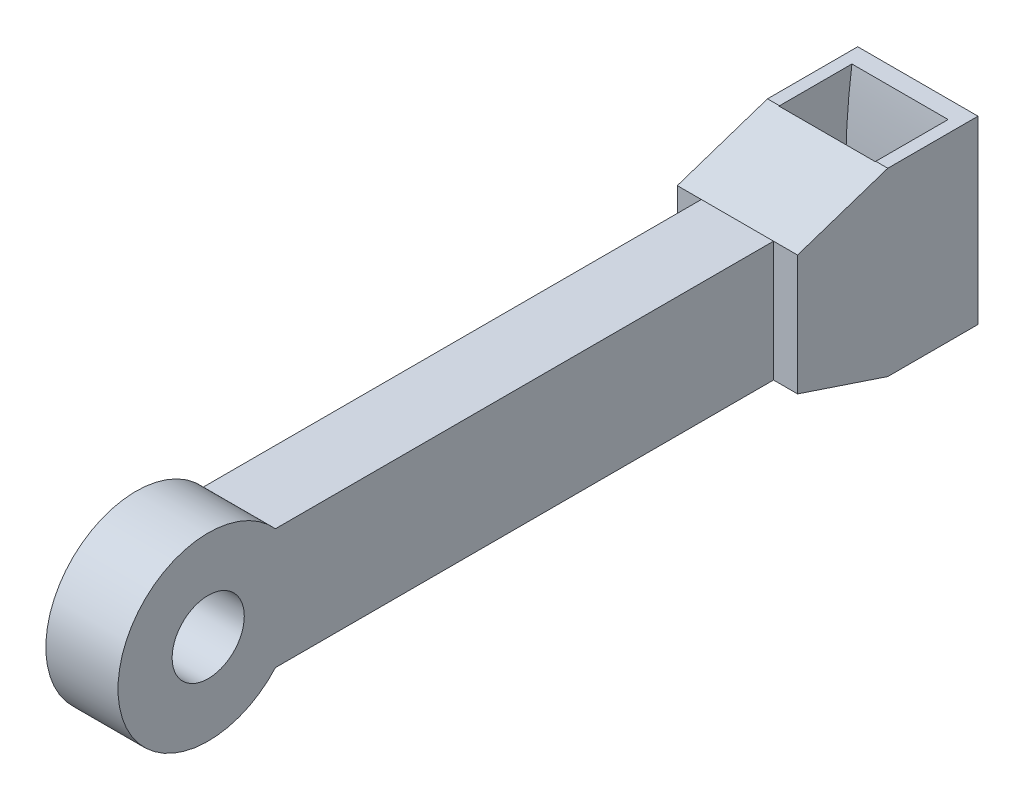
ISO-10303-21;
HEADER;
FILE_DESCRIPTION(('STEP AP214'),'2;1');
FILE_NAME('part.step','',(''),(''),'','','');
FILE_SCHEMA(('AUTOMOTIVE_DESIGN { 1 0 10303 214 1 1 1 1 }'));
ENDSEC;
DATA;
#1=APPLICATION_CONTEXT('core data for automotive mechanical design processes');
#2=APPLICATION_PROTOCOL_DEFINITION('international standard','automotive_design',2000,#1);
#3=PRODUCT_CONTEXT('',#1,'mechanical');
#4=PRODUCT('Part','Part','',(#3));
#5=PRODUCT_RELATED_PRODUCT_CATEGORY('part','',(#4));
#6=PRODUCT_DEFINITION_FORMATION('','',#4);
#7=PRODUCT_DEFINITION_CONTEXT('part definition',#1,'design');
#8=PRODUCT_DEFINITION('design','',#6,#7);
#9=PRODUCT_DEFINITION_SHAPE('','',#8);
#10=(LENGTH_UNIT() NAMED_UNIT(*) SI_UNIT(.MILLI.,.METRE.));
#11=(NAMED_UNIT(*) PLANE_ANGLE_UNIT() SI_UNIT($,.RADIAN.));
#12=(NAMED_UNIT(*) SI_UNIT($,.STERADIAN.) SOLID_ANGLE_UNIT());
#13=UNCERTAINTY_MEASURE_WITH_UNIT(LENGTH_MEASURE(1.E-05),#10,'distance_accuracy_value','');
#14=(GEOMETRIC_REPRESENTATION_CONTEXT(3) GLOBAL_UNCERTAINTY_ASSIGNED_CONTEXT((#13)) GLOBAL_UNIT_ASSIGNED_CONTEXT((#10,
#11,#12)) REPRESENTATION_CONTEXT('',''));
#15=CARTESIAN_POINT('',(0.,0.,0.));
#16=DIRECTION('',(0.,0.,1.));
#17=DIRECTION('',(1.,0.,0.));
#18=AXIS2_PLACEMENT_3D('',#15,#16,#17);
#19=CARTESIAN_POINT('',(0.,-2.5,67.));
#20=DIRECTION('',(0.,-1.,0.));
#21=DIRECTION('',(0.,0.,-1.));
#22=AXIS2_PLACEMENT_3D('',#19,#20,#21);
#23=PLANE('',#22);
#24=DIRECTION('',(0.,0.,-1.));
#25=VECTOR('',#24,1.);
#26=CARTESIAN_POINT('',(2.00000000000001,-2.5,67.));
#27=LINE('',#26,#25);
#28=CARTESIAN_POINT('',(2.00000000000001,-2.5,56.4098300562505));
#29=VERTEX_POINT('',#28);
#30=CARTESIAN_POINT('',(2.,-2.5,15.));
#31=VERTEX_POINT('',#30);
#32=EDGE_CURVE('E169',#29,#31,#27,.T.);
#33=ORIENTED_EDGE('',*,*,#32,.F.);
#34=DIRECTION('',(-1.,0.,0.));
#35=VECTOR('',#34,1.);
#36=CARTESIAN_POINT('',(10.,-2.5,56.4098300562505));
#37=LINE('',#36,#35);
#38=CARTESIAN_POINT('',(8.00000000000001,-2.5,56.4098300562505));
#39=VERTEX_POINT('',#38);
#40=EDGE_CURVE('E11',#29,#39,#37,.F.);
#41=ORIENTED_EDGE('',*,*,#40,.T.);
#42=DIRECTION('',(0.,0.,1.));
#43=VECTOR('',#42,1.);
#44=CARTESIAN_POINT('',(8.00000000000001,-2.5,67.));
#45=LINE('',#44,#43);
#46=CARTESIAN_POINT('',(8.,-2.5,15.));
#47=VERTEX_POINT('',#46);
#48=EDGE_CURVE('E57',#47,#39,#45,.T.);
#49=ORIENTED_EDGE('',*,*,#48,.F.);
#50=DIRECTION('',(1.,0.,0.));
#51=VECTOR('',#50,1.);
#52=CARTESIAN_POINT('',(0.,-2.5,15.));
#53=LINE('',#52,#51);
#54=EDGE_CURVE('E179',#31,#47,#53,.T.);
#55=ORIENTED_EDGE('',*,*,#54,.F.);
#56=EDGE_LOOP('',(#33,#41,#49,#55));
#57=FACE_BOUND('',#56,.T.);
#58=ADVANCED_FACE('F39',(#57),#23,.F.);
#59=CARTESIAN_POINT('',(0.,0.,15.));
#60=DIRECTION('',(1.,0.,0.));
#61=DIRECTION('',(0.,1.,0.));
#62=AXIS2_PLACEMENT_3D('',#59,#60,#61);
#63=PLANE('',#62);
#64=DIRECTION('',(0.,-1.,0.));
#65=VECTOR('',#64,1.);
#66=CARTESIAN_POINT('',(0.,7.5,15.));
#67=LINE('',#66,#65);
#68=CARTESIAN_POINT('',(0.,-2.5,15.));
#69=VERTEX_POINT('',#68);
#70=CARTESIAN_POINT('',(0.,-12.5,15.));
#71=VERTEX_POINT('',#70);
#72=EDGE_CURVE('E220',#69,#71,#67,.T.);
#73=ORIENTED_EDGE('',*,*,#72,.F.);
#74=DIRECTION('',(0.,0.316227766016838,-0.948683298050514));
#75=VECTOR('',#74,1.);
#76=CARTESIAN_POINT('',(0.,-2.25,14.25));
#77=LINE('',#76,#75);
#78=CARTESIAN_POINT('',(0.,0.,7.5));
#79=VERTEX_POINT('',#78);
#80=EDGE_CURVE('E304',#69,#79,#77,.T.);
#81=ORIENTED_EDGE('',*,*,#80,.T.);
#82=DIRECTION('',(0.,0.,-1.));
#83=VECTOR('',#82,1.);
#84=CARTESIAN_POINT('',(0.,0.,15.));
#85=LINE('',#84,#83);
#86=CARTESIAN_POINT('',(0.,0.,0.));
#87=VERTEX_POINT('',#86);
#88=EDGE_CURVE('E324',#79,#87,#85,.T.);
#89=ORIENTED_EDGE('',*,*,#88,.T.);
#90=DIRECTION('',(0.,-1.,0.));
#91=VECTOR('',#90,1.);
#92=CARTESIAN_POINT('',(0.,0.,0.));
#93=LINE('',#92,#91);
#94=CARTESIAN_POINT('',(0.,-15.,0.));
#95=VERTEX_POINT('',#94);
#96=EDGE_CURVE('E308',#87,#95,#93,.T.);
#97=ORIENTED_EDGE('',*,*,#96,.T.);
#98=DIRECTION('',(0.,0.,-1.));
#99=VECTOR('',#98,1.);
#100=CARTESIAN_POINT('',(0.,-15.,15.));
#101=LINE('',#100,#99);
#102=CARTESIAN_POINT('',(0.,-15.,7.5));
#103=VERTEX_POINT('',#102);
#104=EDGE_CURVE('E332',#103,#95,#101,.T.);
#105=ORIENTED_EDGE('',*,*,#104,.F.);
#106=DIRECTION('',(0.,0.316227766016838,0.948683298050514));
#107=VECTOR('',#106,1.);
#108=CARTESIAN_POINT('',(0.,-11.25,18.75));
#109=LINE('',#108,#107);
#110=EDGE_CURVE('E293',#103,#71,#109,.T.);
#111=ORIENTED_EDGE('',*,*,#110,.T.);
#112=EDGE_LOOP('',(#73,#81,#89,#97,#105,#111));
#113=FACE_BOUND('',#112,.T.);
#114=ADVANCED_FACE('F41',(#113),#63,.F.);
#115=CARTESIAN_POINT('',(10.,0.,15.));
#116=DIRECTION('',(-1.,0.,0.));
#117=DIRECTION('',(0.,-1.,0.));
#118=AXIS2_PLACEMENT_3D('',#115,#116,#117);
#119=PLANE('',#118);
#120=DIRECTION('',(0.,-1.,0.));
#121=VECTOR('',#120,1.);
#122=CARTESIAN_POINT('',(10.,7.5,15.));
#123=LINE('',#122,#121);
#124=CARTESIAN_POINT('',(10.,-2.5,15.));
#125=VERTEX_POINT('',#124);
#126=CARTESIAN_POINT('',(10.,-12.5,15.));
#127=VERTEX_POINT('',#126);
#128=EDGE_CURVE('E162',#125,#127,#123,.T.);
#129=ORIENTED_EDGE('',*,*,#128,.T.);
#130=DIRECTION('',(0.,0.316227766016838,0.948683298050514));
#131=VECTOR('',#130,1.);
#132=CARTESIAN_POINT('',(10.,-15.,7.5));
#133=LINE('',#132,#131);
#134=CARTESIAN_POINT('',(10.,-15.,7.5));
#135=VERTEX_POINT('',#134);
#136=EDGE_CURVE('E283',#135,#127,#133,.T.);
#137=ORIENTED_EDGE('',*,*,#136,.F.);
#138=DIRECTION('',(0.,0.,-1.));
#139=VECTOR('',#138,1.);
#140=CARTESIAN_POINT('',(10.,-15.,15.));
#141=LINE('',#140,#139);
#142=CARTESIAN_POINT('',(10.,-15.,0.));
#143=VERTEX_POINT('',#142);
#144=EDGE_CURVE('E330',#135,#143,#141,.T.);
#145=ORIENTED_EDGE('',*,*,#144,.T.);
#146=DIRECTION('',(0.,1.,0.));
#147=VECTOR('',#146,1.);
#148=CARTESIAN_POINT('',(10.,0.,0.));
#149=LINE('',#148,#147);
#150=CARTESIAN_POINT('',(10.,0.,0.));
#151=VERTEX_POINT('',#150);
#152=EDGE_CURVE('E316',#143,#151,#149,.T.);
#153=ORIENTED_EDGE('',*,*,#152,.T.);
#154=DIRECTION('',(0.,0.,-1.));
#155=VECTOR('',#154,1.);
#156=CARTESIAN_POINT('',(10.,0.,15.));
#157=LINE('',#156,#155);
#158=CARTESIAN_POINT('',(10.,0.,7.5));
#159=VERTEX_POINT('',#158);
#160=EDGE_CURVE('E327',#159,#151,#157,.T.);
#161=ORIENTED_EDGE('',*,*,#160,.F.);
#162=DIRECTION('',(0.,0.316227766016838,-0.948683298050514));
#163=VECTOR('',#162,1.);
#164=CARTESIAN_POINT('',(10.,0.,7.5));
#165=LINE('',#164,#163);
#166=EDGE_CURVE('E284',#125,#159,#165,.T.);
#167=ORIENTED_EDGE('',*,*,#166,.F.);
#168=EDGE_LOOP('',(#129,#137,#145,#153,#161,#167));
#169=FACE_BOUND('',#168,.T.);
#170=ADVANCED_FACE('F372',(#169),#119,.F.);
#171=CARTESIAN_POINT('',(0.,-12.5,67.));
#172=DIRECTION('',(0.,1.,0.));
#173=DIRECTION('',(0.,0.,1.));
#174=AXIS2_PLACEMENT_3D('',#171,#172,#173);
#175=PLANE('',#174);
#176=DIRECTION('',(0.,0.,1.));
#177=VECTOR('',#176,1.);
#178=CARTESIAN_POINT('',(2.00000000000001,-12.5,67.));
#179=LINE('',#178,#177);
#180=CARTESIAN_POINT('',(2.,-12.5,15.));
#181=VERTEX_POINT('',#180);
#182=CARTESIAN_POINT('',(2.00000000000001,-12.5,56.4098300562505));
#183=VERTEX_POINT('',#182);
#184=EDGE_CURVE('E65',#181,#183,#179,.T.);
#185=ORIENTED_EDGE('',*,*,#184,.F.);
#186=DIRECTION('',(-1.,0.,0.));
#187=VECTOR('',#186,1.);
#188=CARTESIAN_POINT('',(0.,-12.5,15.));
#189=LINE('',#188,#187);
#190=CARTESIAN_POINT('',(8.,-12.5,15.));
#191=VERTEX_POINT('',#190);
#192=EDGE_CURVE('E195',#191,#181,#189,.T.);
#193=ORIENTED_EDGE('',*,*,#192,.F.);
#194=DIRECTION('',(0.,0.,-1.));
#195=VECTOR('',#194,1.);
#196=CARTESIAN_POINT('',(8.00000000000001,-12.5,67.));
#197=LINE('',#196,#195);
#198=CARTESIAN_POINT('',(8.00000000000001,-12.5,56.4098300562505));
#199=VERTEX_POINT('',#198);
#200=EDGE_CURVE('E173',#199,#191,#197,.T.);
#201=ORIENTED_EDGE('',*,*,#200,.F.);
#202=DIRECTION('',(-1.,0.,0.));
#203=VECTOR('',#202,1.);
#204=CARTESIAN_POINT('',(10.,-12.5,56.4098300562505));
#205=LINE('',#204,#203);
#206=EDGE_CURVE('E168',#199,#183,#205,.T.);
#207=ORIENTED_EDGE('',*,*,#206,.T.);
#208=EDGE_LOOP('',(#185,#193,#201,#207));
#209=FACE_BOUND('',#208,.T.);
#210=ADVANCED_FACE('F346',(#209),#175,.F.);
#211=CARTESIAN_POINT('',(10.,-7.49999999999999,62.));
#212=DIRECTION('',(-1.,0.,0.));
#213=DIRECTION('',(0.,-1.,0.));
#214=AXIS2_PLACEMENT_3D('',#211,#212,#213);
#215=CYLINDRICAL_SURFACE('',#214,7.50000000000001);
#216=ORIENTED_EDGE('',*,*,#40,.F.);
#217=CARTESIAN_POINT('',(2.00000000000001,-7.5,62.));
#218=DIRECTION('',(-1.,0.,0.));
#219=DIRECTION('',(0.,0.,1.));
#220=AXIS2_PLACEMENT_3D('',#217,#218,#219);
#221=CIRCLE('',#220,7.50000000000001);
#222=EDGE_CURVE('E230',#29,#183,#221,.F.);
#223=ORIENTED_EDGE('',*,*,#222,.T.);
#224=ORIENTED_EDGE('',*,*,#206,.F.);
#225=CARTESIAN_POINT('',(8.00000000000001,-7.49999999999999,62.));
#226=DIRECTION('',(1.,0.,0.));
#227=DIRECTION('',(0.,0.,-1.));
#228=AXIS2_PLACEMENT_3D('',#225,#226,#227);
#229=CIRCLE('',#228,7.50000000000001);
#230=EDGE_CURVE('E213',#199,#39,#229,.F.);
#231=ORIENTED_EDGE('',*,*,#230,.T.);
#232=EDGE_LOOP('',(#216,#223,#224,#231));
#233=FACE_BOUND('',#232,.T.);
#234=ADVANCED_FACE('F349',(#233),#215,.T.);
#235=CARTESIAN_POINT('',(0.,-15.,15.));
#236=DIRECTION('',(0.,1.,0.));
#237=DIRECTION('',(0.,0.,1.));
#238=AXIS2_PLACEMENT_3D('',#235,#236,#237);
#239=PLANE('',#238);
#240=DIRECTION('',(1.,0.,0.));
#241=VECTOR('',#240,1.);
#242=CARTESIAN_POINT('',(-20.,-15.,7.5));
#243=LINE('',#242,#241);
#244=CARTESIAN_POINT('',(9.00000000000001,-15.,7.5));
#245=VERTEX_POINT('',#244);
#246=EDGE_CURVE('E297',#245,#135,#243,.T.);
#247=ORIENTED_EDGE('',*,*,#246,.F.);
#248=DIRECTION('',(0.,0.,-1.));
#249=VECTOR('',#248,1.);
#250=CARTESIAN_POINT('',(9.00000000000001,-15.,15.));
#251=LINE('',#250,#249);
#252=CARTESIAN_POINT('',(9.00000000000001,-15.,1.48287265641184));
#253=VERTEX_POINT('',#252);
#254=EDGE_CURVE('E272',#245,#253,#251,.T.);
#255=ORIENTED_EDGE('',*,*,#254,.T.);
#256=DIRECTION('',(-1.,0.,0.));
#257=VECTOR('',#256,1.);
#258=CARTESIAN_POINT('',(9.,-15.,1.48287265641184));
#259=LINE('',#258,#257);
#260=CARTESIAN_POINT('',(1.00000000000001,-15.,1.48287265641185));
#261=VERTEX_POINT('',#260);
#262=EDGE_CURVE('E280',#261,#253,#259,.F.);
#263=ORIENTED_EDGE('',*,*,#262,.F.);
#264=DIRECTION('',(0.,0.,-1.));
#265=VECTOR('',#264,1.);
#266=CARTESIAN_POINT('',(1.00000000000001,-15.,15.));
#267=LINE('',#266,#265);
#268=CARTESIAN_POINT('',(1.00000000000001,-15.,7.5));
#269=VERTEX_POINT('',#268);
#270=EDGE_CURVE('E261',#269,#261,#267,.T.);
#271=ORIENTED_EDGE('',*,*,#270,.F.);
#272=EDGE_CURVE('E288',#103,#269,#243,.T.);
#273=ORIENTED_EDGE('',*,*,#272,.F.);
#274=ORIENTED_EDGE('',*,*,#104,.T.);
#275=DIRECTION('',(1.,0.,0.));
#276=VECTOR('',#275,1.);
#277=CARTESIAN_POINT('',(0.,-15.,0.));
#278=LINE('',#277,#276);
#279=EDGE_CURVE('E312',#95,#143,#278,.T.);
#280=ORIENTED_EDGE('',*,*,#279,.T.);
#281=ORIENTED_EDGE('',*,*,#144,.F.);
#282=EDGE_LOOP('',(#247,#255,#263,#271,#273,#274,#280,#281));
#283=FACE_BOUND('',#282,.T.);
#284=ADVANCED_FACE('F369',(#283),#239,.F.);
#285=CARTESIAN_POINT('',(0.,0.,15.));
#286=DIRECTION('',(0.,-1.,0.));
#287=DIRECTION('',(0.,0.,-1.));
#288=AXIS2_PLACEMENT_3D('',#285,#286,#287);
#289=PLANE('',#288);
#290=DIRECTION('',(-1.,0.,0.));
#291=VECTOR('',#290,1.);
#292=CARTESIAN_POINT('',(9.,0.,1.48287265641185));
#293=LINE('',#292,#291);
#294=CARTESIAN_POINT('',(9.,0.,1.48287265641185));
#295=VERTEX_POINT('',#294);
#296=CARTESIAN_POINT('',(0.999999999999998,0.,1.48287265641185));
#297=VERTEX_POINT('',#296);
#298=EDGE_CURVE('E49',#295,#297,#293,.T.);
#299=ORIENTED_EDGE('',*,*,#298,.F.);
#300=DIRECTION('',(0.,0.,1.));
#301=VECTOR('',#300,1.);
#302=CARTESIAN_POINT('',(9.,0.,15.));
#303=LINE('',#302,#301);
#304=CARTESIAN_POINT('',(9.,0.,7.5));
#305=VERTEX_POINT('',#304);
#306=EDGE_CURVE('E264',#295,#305,#303,.T.);
#307=ORIENTED_EDGE('',*,*,#306,.T.);
#308=DIRECTION('',(1.,0.,0.));
#309=VECTOR('',#308,1.);
#310=CARTESIAN_POINT('',(-20.,0.,7.5));
#311=LINE('',#310,#309);
#312=EDGE_CURVE('E287',#305,#159,#311,.T.);
#313=ORIENTED_EDGE('',*,*,#312,.T.);
#314=ORIENTED_EDGE('',*,*,#160,.T.);
#315=DIRECTION('',(-1.,0.,0.));
#316=VECTOR('',#315,1.);
#317=CARTESIAN_POINT('',(0.,0.,0.));
#318=LINE('',#317,#316);
#319=EDGE_CURVE('E320',#151,#87,#318,.T.);
#320=ORIENTED_EDGE('',*,*,#319,.T.);
#321=ORIENTED_EDGE('',*,*,#88,.F.);
#322=CARTESIAN_POINT('',(1.,0.,7.5));
#323=VERTEX_POINT('',#322);
#324=EDGE_CURVE('E289',#79,#323,#311,.T.);
#325=ORIENTED_EDGE('',*,*,#324,.T.);
#326=DIRECTION('',(0.,0.,1.));
#327=VECTOR('',#326,1.);
#328=CARTESIAN_POINT('',(0.999999999999999,0.,15.));
#329=LINE('',#328,#327);
#330=EDGE_CURVE('E255',#297,#323,#329,.T.);
#331=ORIENTED_EDGE('',*,*,#330,.F.);
#332=EDGE_LOOP('',(#299,#307,#313,#314,#320,#321,#325,#331));
#333=FACE_BOUND('',#332,.T.);
#334=ADVANCED_FACE('F361',(#333),#289,.F.);
#335=CARTESIAN_POINT('',(0.,0.,0.));
#336=DIRECTION('',(0.,0.,1.));
#337=DIRECTION('',(1.,0.,0.));
#338=AXIS2_PLACEMENT_3D('',#335,#336,#337);
#339=PLANE('',#338);
#340=ORIENTED_EDGE('',*,*,#96,.F.);
#341=ORIENTED_EDGE('',*,*,#319,.F.);
#342=ORIENTED_EDGE('',*,*,#152,.F.);
#343=ORIENTED_EDGE('',*,*,#279,.F.);
#344=EDGE_LOOP('',(#340,#341,#342,#343));
#345=FACE_BOUND('',#344,.T.);
#346=ADVANCED_FACE('F365',(#345),#339,.F.);
#347=CARTESIAN_POINT('',(-20.,-15.,7.5));
#348=DIRECTION('',(0.,0.948683298050514,-0.316227766016838));
#349=DIRECTION('',(0.,0.316227766016838,0.948683298050514));
#350=AXIS2_PLACEMENT_3D('',#347,#348,#349);
#351=PLANE('',#350);
#352=DIRECTION('',(-1.,0.,0.));
#353=VECTOR('',#352,1.);
#354=CARTESIAN_POINT('',(9.,-14.9880183916461,7.53594482506161));
#355=LINE('',#354,#353);
#356=CARTESIAN_POINT('',(9.00000000000001,-14.9880183916461,7.53594482506162));
#357=VERTEX_POINT('',#356);
#358=CARTESIAN_POINT('',(1.00000000000001,-14.9880183916461,7.53594482506162));
#359=VERTEX_POINT('',#358);
#360=EDGE_CURVE('E276',#357,#359,#355,.T.);
#361=ORIENTED_EDGE('',*,*,#360,.F.);
#362=DIRECTION('',(0.,-0.316227766016838,-0.948683298050514));
#363=VECTOR('',#362,1.);
#364=CARTESIAN_POINT('',(9.00000000000001,-15.,7.5));
#365=LINE('',#364,#363);
#366=EDGE_CURVE('E268',#357,#245,#365,.T.);
#367=ORIENTED_EDGE('',*,*,#366,.T.);
#368=ORIENTED_EDGE('',*,*,#246,.T.);
#369=ORIENTED_EDGE('',*,*,#136,.T.);
#370=EDGE_CURVE('E189',#127,#191,#189,.T.);
#371=ORIENTED_EDGE('',*,*,#370,.T.);
#372=ORIENTED_EDGE('',*,*,#192,.T.);
#373=EDGE_CURVE('E197',#181,#71,#189,.T.);
#374=ORIENTED_EDGE('',*,*,#373,.T.);
#375=ORIENTED_EDGE('',*,*,#110,.F.);
#376=ORIENTED_EDGE('',*,*,#272,.T.);
#377=DIRECTION('',(0.,-0.316227766016838,-0.948683298050514));
#378=VECTOR('',#377,1.);
#379=CARTESIAN_POINT('',(1.00000000000001,-15.,7.5));
#380=LINE('',#379,#378);
#381=EDGE_CURVE('E258',#359,#269,#380,.T.);
#382=ORIENTED_EDGE('',*,*,#381,.F.);
#383=EDGE_LOOP('',(#361,#367,#368,#369,#371,#372,#374,#375,#376,#382));
#384=FACE_BOUND('',#383,.T.);
#385=ADVANCED_FACE('F344',(#384),#351,.F.);
#386=CARTESIAN_POINT('',(-20.,0.,7.5));
#387=DIRECTION('',(0.,-0.948683298050514,-0.316227766016838));
#388=DIRECTION('',(0.,0.316227766016838,-0.948683298050514));
#389=AXIS2_PLACEMENT_3D('',#386,#387,#388);
#390=PLANE('',#389);
#391=ORIENTED_EDGE('',*,*,#312,.F.);
#392=DIRECTION('',(0.,-0.316227766016838,0.948683298050514));
#393=VECTOR('',#392,1.);
#394=CARTESIAN_POINT('',(9.,0.,7.5));
#395=LINE('',#394,#393);
#396=CARTESIAN_POINT('',(9.,-0.0119816083538581,7.53594482506161));
#397=VERTEX_POINT('',#396);
#398=EDGE_CURVE('E205',#305,#397,#395,.T.);
#399=ORIENTED_EDGE('',*,*,#398,.T.);
#400=DIRECTION('',(-1.,0.,0.));
#401=VECTOR('',#400,1.);
#402=CARTESIAN_POINT('',(9.,-0.0119816083538685,7.53594482506161));
#403=LINE('',#402,#401);
#404=CARTESIAN_POINT('',(0.999999999999998,-0.0119816083538615,7.53594482506161));
#405=VERTEX_POINT('',#404);
#406=EDGE_CURVE('E202',#405,#397,#403,.F.);
#407=ORIENTED_EDGE('',*,*,#406,.F.);
#408=DIRECTION('',(0.,-0.316227766016838,0.948683298050514));
#409=VECTOR('',#408,1.);
#410=CARTESIAN_POINT('',(1.,0.,7.5));
#411=LINE('',#410,#409);
#412=EDGE_CURVE('E193',#323,#405,#411,.T.);
#413=ORIENTED_EDGE('',*,*,#412,.F.);
#414=ORIENTED_EDGE('',*,*,#324,.F.);
#415=ORIENTED_EDGE('',*,*,#80,.F.);
#416=EDGE_CURVE('E187',#69,#31,#53,.T.);
#417=ORIENTED_EDGE('',*,*,#416,.T.);
#418=ORIENTED_EDGE('',*,*,#54,.T.);
#419=DIRECTION('',(-1.,0.,0.));
#420=VECTOR('',#419,1.);
#421=CARTESIAN_POINT('',(-20.,-2.50000000000001,15.));
#422=LINE('',#421,#420);
#423=EDGE_CURVE('E157',#125,#47,#422,.T.);
#424=ORIENTED_EDGE('',*,*,#423,.F.);
#425=ORIENTED_EDGE('',*,*,#166,.T.);
#426=EDGE_LOOP('',(#391,#399,#407,#413,#414,#415,#417,#418,#424,#425));
#427=FACE_BOUND('',#426,.T.);
#428=ADVANCED_FACE('F185',(#427),#390,.F.);
#429=CARTESIAN_POINT('',(9.,-7.49999999999999,-52.6455543206574));
#430=DIRECTION('',(-1.,0.,0.));
#431=DIRECTION('',(0.,-1.,0.));
#432=AXIS2_PLACEMENT_3D('',#429,#430,#431);
#433=CYLINDRICAL_SURFACE('',#432,54.6455543206574);
#434=ORIENTED_EDGE('',*,*,#262,.T.);
#435=CARTESIAN_POINT('',(9.,-7.49999999999999,-52.6455543206574));
#436=DIRECTION('',(-1.,0.,0.));
#437=DIRECTION('',(0.,1.,0.));
#438=AXIS2_PLACEMENT_3D('',#435,#436,#437);
#439=CIRCLE('',#438,54.6455543206574);
#440=EDGE_CURVE('E251',#253,#295,#439,.T.);
#441=ORIENTED_EDGE('',*,*,#440,.T.);
#442=ORIENTED_EDGE('',*,*,#298,.T.);
#443=CARTESIAN_POINT('',(1.,-7.5,-52.6455543206574));
#444=DIRECTION('',(-1.,0.,0.));
#445=DIRECTION('',(0.,1.,0.));
#446=AXIS2_PLACEMENT_3D('',#443,#444,#445);
#447=CIRCLE('',#446,54.6455543206574);
#448=EDGE_CURVE('E243',#261,#297,#447,.T.);
#449=ORIENTED_EDGE('',*,*,#448,.F.);
#450=EDGE_LOOP('',(#434,#441,#442,#449));
#451=FACE_BOUND('',#450,.T.);
#452=ADVANCED_FACE('F407',(#451),#433,.T.);
#453=CARTESIAN_POINT('',(9.,-7.49999999999999,-52.6455543206574));
#454=DIRECTION('',(-1.,0.,0.));
#455=DIRECTION('',(0.,-1.,0.));
#456=AXIS2_PLACEMENT_3D('',#453,#454,#455);
#457=CYLINDRICAL_SURFACE('',#456,60.6455543206574);
#458=ORIENTED_EDGE('',*,*,#360,.T.);
#459=CARTESIAN_POINT('',(1.,-7.5,-52.6455543206574));
#460=DIRECTION('',(1.,0.,0.));
#461=DIRECTION('',(0.,1.,0.));
#462=AXIS2_PLACEMENT_3D('',#459,#460,#461);
#463=CIRCLE('',#462,60.6455543206574);
#464=EDGE_CURVE('E240',#405,#359,#463,.T.);
#465=ORIENTED_EDGE('',*,*,#464,.F.);
#466=ORIENTED_EDGE('',*,*,#406,.T.);
#467=CARTESIAN_POINT('',(9.,-7.49999999999999,-52.6455543206574));
#468=DIRECTION('',(1.,0.,0.));
#469=DIRECTION('',(0.,1.,0.));
#470=AXIS2_PLACEMENT_3D('',#467,#468,#469);
#471=CIRCLE('',#470,60.6455543206574);
#472=EDGE_CURVE('E247',#397,#357,#471,.T.);
#473=ORIENTED_EDGE('',*,*,#472,.T.);
#474=EDGE_LOOP('',(#458,#465,#466,#473));
#475=FACE_BOUND('',#474,.T.);
#476=ADVANCED_FACE('F405',(#475),#457,.F.);
#477=CARTESIAN_POINT('',(8.99999999999999,11.966218331513,-31.3895239503405));
#478=DIRECTION('',(1.,0.,0.));
#479=DIRECTION('',(0.,1.,0.));
#480=AXIS2_PLACEMENT_3D('',#477,#478,#479);
#481=PLANE('',#480);
#482=ORIENTED_EDGE('',*,*,#366,.F.);
#483=ORIENTED_EDGE('',*,*,#472,.F.);
#484=ORIENTED_EDGE('',*,*,#398,.F.);
#485=ORIENTED_EDGE('',*,*,#306,.F.);
#486=ORIENTED_EDGE('',*,*,#440,.F.);
#487=ORIENTED_EDGE('',*,*,#254,.F.);
#488=EDGE_LOOP('',(#482,#483,#484,#485,#486,#487));
#489=FACE_BOUND('',#488,.T.);
#490=ADVANCED_FACE('F401',(#489),#481,.F.);
#491=CARTESIAN_POINT('',(0.999999999999993,11.966218331513,-31.3895239503405));
#492=DIRECTION('',(1.,0.,0.));
#493=DIRECTION('',(0.,1.,0.));
#494=AXIS2_PLACEMENT_3D('',#491,#492,#493);
#495=PLANE('',#494);
#496=ORIENTED_EDGE('',*,*,#270,.T.);
#497=ORIENTED_EDGE('',*,*,#448,.T.);
#498=ORIENTED_EDGE('',*,*,#330,.T.);
#499=ORIENTED_EDGE('',*,*,#412,.T.);
#500=ORIENTED_EDGE('',*,*,#464,.T.);
#501=ORIENTED_EDGE('',*,*,#381,.T.);
#502=EDGE_LOOP('',(#496,#497,#498,#499,#500,#501));
#503=FACE_BOUND('',#502,.T.);
#504=ADVANCED_FACE('F398',(#503),#495,.T.);
#505=CARTESIAN_POINT('',(10.,7.5,15.));
#506=DIRECTION('',(0.,0.,1.));
#507=DIRECTION('',(1.,0.,0.));
#508=AXIS2_PLACEMENT_3D('',#505,#506,#507);
#509=PLANE('',#508);
#510=ORIENTED_EDGE('',*,*,#423,.T.);
#511=DIRECTION('',(0.,-1.,0.));
#512=VECTOR('',#511,1.);
#513=CARTESIAN_POINT('',(8.,7.5,15.));
#514=LINE('',#513,#512);
#515=EDGE_CURVE('E159',#47,#191,#514,.T.);
#516=ORIENTED_EDGE('',*,*,#515,.T.);
#517=ORIENTED_EDGE('',*,*,#370,.F.);
#518=ORIENTED_EDGE('',*,*,#128,.F.);
#519=EDGE_LOOP('',(#510,#516,#517,#518));
#520=FACE_BOUND('',#519,.T.);
#521=ADVANCED_FACE('F158',(#520),#509,.T.);
#522=CARTESIAN_POINT('',(8.,7.5,15.));
#523=DIRECTION('',(1.,0.,0.));
#524=DIRECTION('',(0.,0.,-1.));
#525=AXIS2_PLACEMENT_3D('',#522,#523,#524);
#526=PLANE('',#525);
#527=CARTESIAN_POINT('',(8.00000000000001,-7.49999999999999,62.));
#528=DIRECTION('',(1.,0.,0.));
#529=DIRECTION('',(0.,0.,-1.));
#530=AXIS2_PLACEMENT_3D('',#527,#528,#529);
#531=CIRCLE('',#530,3.);
#532=CARTESIAN_POINT('',(8.00000000000001,-7.49999999999999,59.));
#533=VERTEX_POINT('',#532);
#534=EDGE_CURVE('E210',#533,#533,#531,.F.);
#535=ORIENTED_EDGE('',*,*,#534,.T.);
#536=EDGE_LOOP('',(#535));
#537=FACE_BOUND('',#536,.T.);
#538=ORIENTED_EDGE('',*,*,#48,.T.);
#539=ORIENTED_EDGE('',*,*,#230,.F.);
#540=ORIENTED_EDGE('',*,*,#200,.T.);
#541=ORIENTED_EDGE('',*,*,#515,.F.);
#542=EDGE_LOOP('',(#538,#539,#540,#541));
#543=FACE_BOUND('',#542,.T.);
#544=ADVANCED_FACE('F171',(#537,#543),#526,.T.);
#545=CARTESIAN_POINT('',(0.,7.5,15.));
#546=DIRECTION('',(0.,0.,1.));
#547=DIRECTION('',(1.,0.,0.));
#548=AXIS2_PLACEMENT_3D('',#545,#546,#547);
#549=PLANE('',#548);
#550=ORIENTED_EDGE('',*,*,#416,.F.);
#551=ORIENTED_EDGE('',*,*,#72,.T.);
#552=ORIENTED_EDGE('',*,*,#373,.F.);
#553=DIRECTION('',(0.,-1.,0.));
#554=VECTOR('',#553,1.);
#555=CARTESIAN_POINT('',(2.,7.5,15.));
#556=LINE('',#555,#554);
#557=EDGE_CURVE('E214',#31,#181,#556,.T.);
#558=ORIENTED_EDGE('',*,*,#557,.F.);
#559=EDGE_LOOP('',(#550,#551,#552,#558));
#560=FACE_BOUND('',#559,.T.);
#561=ADVANCED_FACE('F352',(#560),#549,.T.);
#562=CARTESIAN_POINT('',(2.,7.5,15.));
#563=DIRECTION('',(-1.,0.,0.));
#564=DIRECTION('',(0.,0.,1.));
#565=AXIS2_PLACEMENT_3D('',#562,#563,#564);
#566=PLANE('',#565);
#567=CARTESIAN_POINT('',(2.00000000000001,-7.5,62.));
#568=DIRECTION('',(-1.,0.,0.));
#569=DIRECTION('',(0.,0.,1.));
#570=AXIS2_PLACEMENT_3D('',#567,#568,#569);
#571=CIRCLE('',#570,3.);
#572=CARTESIAN_POINT('',(2.00000000000001,-7.5,65.));
#573=VERTEX_POINT('',#572);
#574=EDGE_CURVE('E43',#573,#573,#571,.F.);
#575=ORIENTED_EDGE('',*,*,#574,.T.);
#576=EDGE_LOOP('',(#575));
#577=FACE_BOUND('',#576,.T.);
#578=ORIENTED_EDGE('',*,*,#32,.T.);
#579=ORIENTED_EDGE('',*,*,#557,.T.);
#580=ORIENTED_EDGE('',*,*,#184,.T.);
#581=ORIENTED_EDGE('',*,*,#222,.F.);
#582=EDGE_LOOP('',(#578,#579,#580,#581));
#583=FACE_BOUND('',#582,.T.);
#584=ADVANCED_FACE('F350',(#577,#583),#566,.T.);
#585=CARTESIAN_POINT('',(10.,-7.49999999999999,62.));
#586=DIRECTION('',(-1.,0.,0.));
#587=DIRECTION('',(0.,-1.,0.));
#588=AXIS2_PLACEMENT_3D('',#585,#586,#587);
#589=CYLINDRICAL_SURFACE('',#588,3.);
#590=ORIENTED_EDGE('',*,*,#534,.F.);
#591=EDGE_LOOP('',(#590));
#592=FACE_BOUND('',#591,.T.);
#593=ORIENTED_EDGE('',*,*,#574,.F.);
#594=EDGE_LOOP('',(#593));
#595=FACE_BOUND('',#594,.T.);
#596=ADVANCED_FACE('F380',(#592,#595),#589,.F.);
#597=CLOSED_SHELL('',(#58,#114,#170,#210,#234,#284,#334,#346,#385,#428,#452,#476,#490,#504,#521,
#544,#561,#584,#596));
#598=MANIFOLD_SOLID_BREP('B2',#597);
#599=ADVANCED_BREP_SHAPE_REPRESENTATION('',(#18,#598),#14);
#600=SHAPE_DEFINITION_REPRESENTATION(#9,#599);
ENDSEC;
END-ISO-10303-21;
